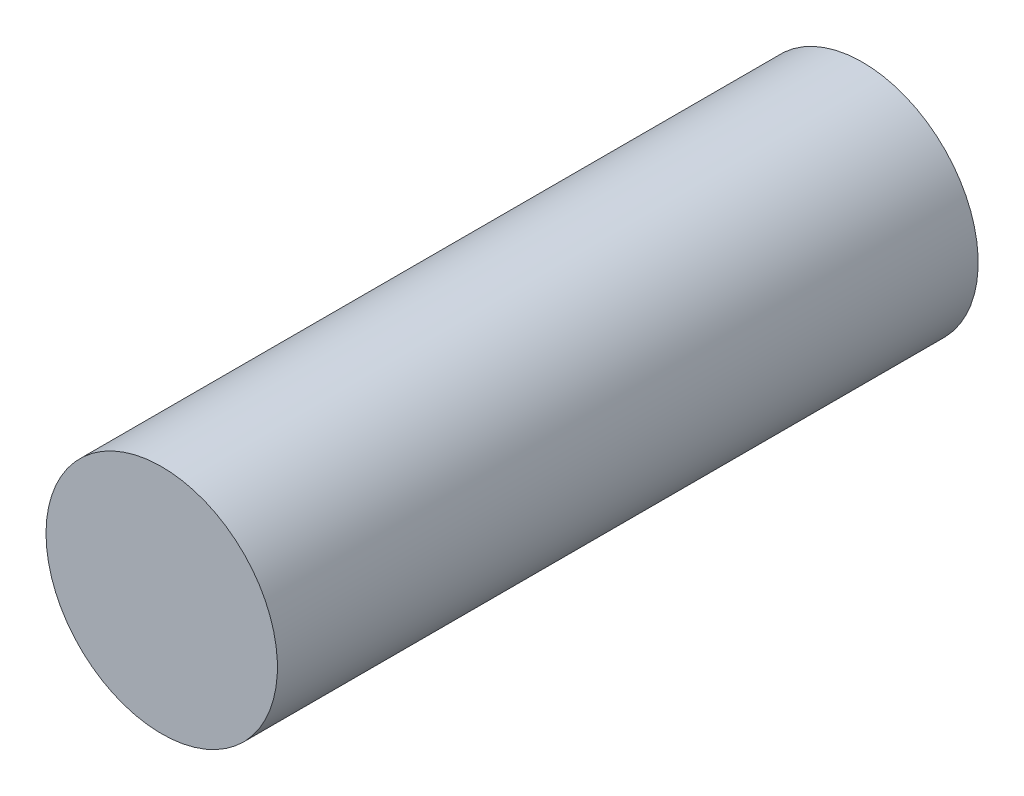
ISO-10303-21;
HEADER;
FILE_DESCRIPTION(('STEP AP214'),'2;1');
FILE_NAME('part.step','',(''),(''),'','','');
FILE_SCHEMA(('AUTOMOTIVE_DESIGN { 1 0 10303 214 1 1 1 1 }'));
ENDSEC;
DATA;
#1=APPLICATION_CONTEXT('core data for automotive mechanical design processes');
#2=APPLICATION_PROTOCOL_DEFINITION('international standard','automotive_design',2000,#1);
#3=PRODUCT_CONTEXT('',#1,'mechanical');
#4=PRODUCT('Part','Part','',(#3));
#5=PRODUCT_RELATED_PRODUCT_CATEGORY('part','',(#4));
#6=PRODUCT_DEFINITION_FORMATION('','',#4);
#7=PRODUCT_DEFINITION_CONTEXT('part definition',#1,'design');
#8=PRODUCT_DEFINITION('design','',#6,#7);
#9=PRODUCT_DEFINITION_SHAPE('','',#8);
#10=(LENGTH_UNIT() NAMED_UNIT(*) SI_UNIT(.MILLI.,.METRE.));
#11=(NAMED_UNIT(*) PLANE_ANGLE_UNIT() SI_UNIT($,.RADIAN.));
#12=(NAMED_UNIT(*) SI_UNIT($,.STERADIAN.) SOLID_ANGLE_UNIT());
#13=UNCERTAINTY_MEASURE_WITH_UNIT(LENGTH_MEASURE(1.E-05),#10,'distance_accuracy_value','');
#14=(GEOMETRIC_REPRESENTATION_CONTEXT(3) GLOBAL_UNCERTAINTY_ASSIGNED_CONTEXT((#13)) GLOBAL_UNIT_ASSIGNED_CONTEXT((#10,
#11,#12)) REPRESENTATION_CONTEXT('',''));
#15=CARTESIAN_POINT('',(0.,0.,0.));
#16=DIRECTION('',(0.,0.,1.));
#17=DIRECTION('',(1.,0.,0.));
#18=AXIS2_PLACEMENT_3D('',#15,#16,#17);
#19=CARTESIAN_POINT('',(0.,0.,43.3));
#20=DIRECTION('',(0.,0.,-1.));
#21=DIRECTION('',(-1.,0.,0.));
#22=AXIS2_PLACEMENT_3D('',#19,#20,#21);
#23=CYLINDRICAL_SURFACE('',#22,7.15);
#24=CARTESIAN_POINT('',(0.,0.,43.3));
#25=DIRECTION('',(0.,0.,1.));
#26=DIRECTION('',(1.,0.,0.));
#27=AXIS2_PLACEMENT_3D('',#24,#25,#26);
#28=CIRCLE('',#27,7.15);
#29=CARTESIAN_POINT('',(-7.15,0.,43.3));
#30=VERTEX_POINT('',#29);
#31=EDGE_CURVE('E10',#30,#30,#28,.T.);
#32=CARTESIAN_POINT('',(0.,0.,0.));
#33=DIRECTION('',(0.,0.,1.));
#34=DIRECTION('',(1.,0.,0.));
#35=AXIS2_PLACEMENT_3D('',#32,#33,#34);
#36=CIRCLE('',#35,7.15);
#37=CARTESIAN_POINT('',(-7.15,0.,0.));
#38=VERTEX_POINT('',#37);
#39=EDGE_CURVE('E46',#38,#38,#36,.T.);
#40=CARTESIAN_POINT('',(-7.15,0.,43.3));
#41=CARTESIAN_POINT('',(-7.15,0.,42.8489583333333));
#42=CARTESIAN_POINT('',(-7.15,0.,42.3979166666667));
#43=CARTESIAN_POINT('',(-7.15,0.,41.4958333333333));
#44=CARTESIAN_POINT('',(-7.15,0.,41.0447916666667));
#45=CARTESIAN_POINT('',(-7.15,0.,40.1427083333333));
#46=CARTESIAN_POINT('',(-7.15,0.,39.6916666666667));
#47=CARTESIAN_POINT('',(-7.15,0.,38.7895833333333));
#48=CARTESIAN_POINT('',(-7.15,0.,38.3385416666667));
#49=CARTESIAN_POINT('',(-7.15,0.,37.4364583333333));
#50=CARTESIAN_POINT('',(-7.15,0.,36.9854166666667));
#51=CARTESIAN_POINT('',(-7.15,0.,36.0833333333333));
#52=CARTESIAN_POINT('',(-7.15,0.,35.6322916666667));
#53=CARTESIAN_POINT('',(-7.15,0.,34.7302083333333));
#54=CARTESIAN_POINT('',(-7.15,0.,34.2791666666667));
#55=CARTESIAN_POINT('',(-7.15,0.,33.3770833333333));
#56=CARTESIAN_POINT('',(-7.15,0.,32.9260416666667));
#57=CARTESIAN_POINT('',(-7.15,0.,32.0239583333333));
#58=CARTESIAN_POINT('',(-7.15,0.,31.5729166666667));
#59=CARTESIAN_POINT('',(-7.15,0.,30.6708333333333));
#60=CARTESIAN_POINT('',(-7.15,0.,30.2197916666667));
#61=CARTESIAN_POINT('',(-7.15,0.,29.3177083333333));
#62=CARTESIAN_POINT('',(-7.15,0.,28.8666666666667));
#63=CARTESIAN_POINT('',(-7.15,0.,27.9645833333333));
#64=CARTESIAN_POINT('',(-7.15,0.,27.5135416666667));
#65=CARTESIAN_POINT('',(-7.15,0.,26.6114583333333));
#66=CARTESIAN_POINT('',(-7.15,0.,26.1604166666667));
#67=CARTESIAN_POINT('',(-7.15,0.,25.2583333333333));
#68=CARTESIAN_POINT('',(-7.15,0.,24.8072916666667));
#69=CARTESIAN_POINT('',(-7.15,0.,23.9052083333333));
#70=CARTESIAN_POINT('',(-7.15,0.,23.4541666666667));
#71=CARTESIAN_POINT('',(-7.15,0.,22.5520833333333));
#72=CARTESIAN_POINT('',(-7.15,0.,22.1010416666667));
#73=CARTESIAN_POINT('',(-7.15,0.,21.1989583333333));
#74=CARTESIAN_POINT('',(-7.15,0.,20.7479166666667));
#75=CARTESIAN_POINT('',(-7.15,0.,19.8458333333333));
#76=CARTESIAN_POINT('',(-7.15,0.,19.3947916666667));
#77=CARTESIAN_POINT('',(-7.15,0.,18.4927083333333));
#78=CARTESIAN_POINT('',(-7.15,0.,18.0416666666667));
#79=CARTESIAN_POINT('',(-7.15,0.,17.1395833333333));
#80=CARTESIAN_POINT('',(-7.15,0.,16.6885416666667));
#81=CARTESIAN_POINT('',(-7.15,0.,15.7864583333333));
#82=CARTESIAN_POINT('',(-7.15,0.,15.3354166666667));
#83=CARTESIAN_POINT('',(-7.15,0.,14.4333333333333));
#84=CARTESIAN_POINT('',(-7.15,0.,13.9822916666667));
#85=CARTESIAN_POINT('',(-7.15,0.,13.0802083333333));
#86=CARTESIAN_POINT('',(-7.15,0.,12.6291666666667));
#87=CARTESIAN_POINT('',(-7.15,0.,11.7270833333333));
#88=CARTESIAN_POINT('',(-7.15,0.,11.2760416666667));
#89=CARTESIAN_POINT('',(-7.15,0.,10.3739583333333));
#90=CARTESIAN_POINT('',(-7.15,0.,9.92291666666667));
#91=CARTESIAN_POINT('',(-7.15,0.,9.02083333333334));
#92=CARTESIAN_POINT('',(-7.15,0.,8.56979166666667));
#93=CARTESIAN_POINT('',(-7.15,0.,7.66770833333333));
#94=CARTESIAN_POINT('',(-7.15,0.,7.21666666666667));
#95=CARTESIAN_POINT('',(-7.15,0.,6.31458333333333));
#96=CARTESIAN_POINT('',(-7.15,0.,5.86354166666667));
#97=CARTESIAN_POINT('',(-7.15,0.,4.96145833333333));
#98=CARTESIAN_POINT('',(-7.15,0.,4.51041666666667));
#99=CARTESIAN_POINT('',(-7.15,0.,3.60833333333334));
#100=CARTESIAN_POINT('',(-7.15,0.,3.15729166666667));
#101=CARTESIAN_POINT('',(-7.15,0.,2.25520833333333));
#102=CARTESIAN_POINT('',(-7.15,0.,1.80416666666666));
#103=CARTESIAN_POINT('',(-7.15,0.,0.902083333333331));
#104=CARTESIAN_POINT('',(-7.15,0.,0.451041666666665));
#105=CARTESIAN_POINT('',(-7.15,0.,0.));
#106=B_SPLINE_CURVE_WITH_KNOTS('',3,(#40,#41,#42,#43,#44,#45,#46,#47,#48,#49,#50,#51,#52,#53,
#54,#55,#56,#57,#58,#59,#60,#61,#62,#63,#64,#65,#66,#67,#68,#69,#70,#71,#72,#73,#74,#75,#76,#77,
#78,#79,#80,#81,#82,#83,#84,#85,#86,#87,#88,#89,#90,#91,#92,#93,#94,#95,#96,#97,#98,#99,#100,
#101,#102,#103,#104,#105),.UNSPECIFIED.,.F.,.F.,(4,2,2,2,2,2,2,2,2,2,2,2,2,2,2,2,2,2,2,2,2,2,2,
2,2,2,2,2,2,2,2,2,4),(0.,1.353125,2.70625,4.059375,5.4125,6.765625,8.11875,9.471875,10.825,
12.178125,13.53125,14.884375,16.2375,17.590625,18.94375,20.296875,21.65,23.003125,24.35625,
25.709375,27.0625,28.415625,29.76875,31.121875,32.475,33.828125,35.18125,36.534375,37.8875,
39.240625,40.59375,41.946875,43.3),.UNSPECIFIED.);
#107=EDGE_CURVE('BSEAM43',#30,#38,#106,.T.);
#108=ORIENTED_EDGE('',*,*,#31,.F.);
#109=ORIENTED_EDGE('',*,*,#39,.T.);
#110=ORIENTED_EDGE('',*,*,#107,.T.);
#111=ORIENTED_EDGE('',*,*,#107,.F.);
#112=EDGE_LOOP('',(#108,#110,#109,#111));
#113=FACE_BOUND('',#112,.T.);
#114=ADVANCED_FACE('F43',(#113),#23,.T.);
#115=CARTESIAN_POINT('',(0.,0.,43.3));
#116=DIRECTION('',(0.,0.,1.));
#117=DIRECTION('',(1.,0.,0.));
#118=AXIS2_PLACEMENT_3D('',#115,#116,#117);
#119=PLANE('',#118);
#120=ORIENTED_EDGE('',*,*,#31,.T.);
#121=EDGE_LOOP('',(#120));
#122=FACE_BOUND('',#121,.T.);
#123=ADVANCED_FACE('F60',(#122),#119,.T.);
#124=CARTESIAN_POINT('',(0.,0.,0.));
#125=DIRECTION('',(0.,0.,1.));
#126=DIRECTION('',(1.,0.,0.));
#127=AXIS2_PLACEMENT_3D('',#124,#125,#126);
#128=PLANE('',#127);
#129=ORIENTED_EDGE('',*,*,#39,.F.);
#130=EDGE_LOOP('',(#129));
#131=FACE_BOUND('',#130,.T.);
#132=ADVANCED_FACE('F58',(#131),#128,.F.);
#133=CLOSED_SHELL('',(#114,#123,#132));
#134=MANIFOLD_SOLID_BREP('B2',#133);
#135=ADVANCED_BREP_SHAPE_REPRESENTATION('',(#18,#134),#14);
#136=SHAPE_DEFINITION_REPRESENTATION(#9,#135);
ENDSEC;
END-ISO-10303-21;
